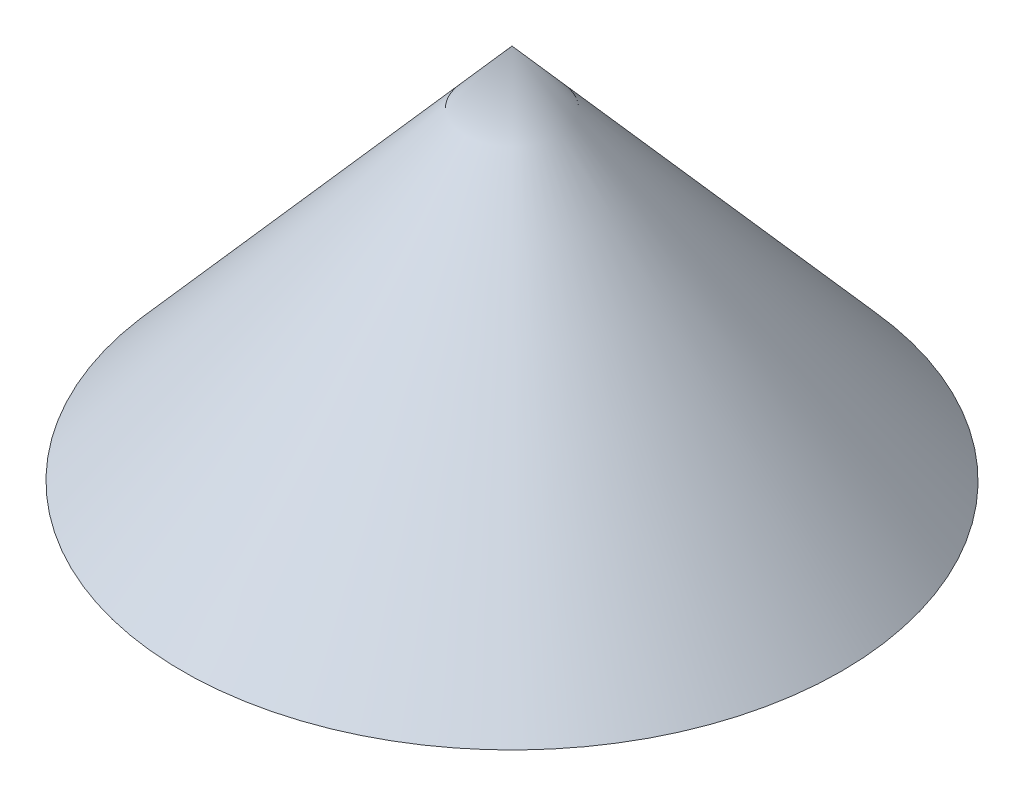
ISO-10303-21;
HEADER;
FILE_DESCRIPTION(('STEP AP214'),'2;1');
FILE_NAME('part.step','',(''),(''),'','','');
FILE_SCHEMA(('AUTOMOTIVE_DESIGN { 1 0 10303 214 1 1 1 1 }'));
ENDSEC;
DATA;
#1=APPLICATION_CONTEXT('core data for automotive mechanical design processes');
#2=APPLICATION_PROTOCOL_DEFINITION('international standard','automotive_design',2000,#1);
#3=PRODUCT_CONTEXT('',#1,'mechanical');
#4=PRODUCT('Part','Part','',(#3));
#5=PRODUCT_RELATED_PRODUCT_CATEGORY('part','',(#4));
#6=PRODUCT_DEFINITION_FORMATION('','',#4);
#7=PRODUCT_DEFINITION_CONTEXT('part definition',#1,'design');
#8=PRODUCT_DEFINITION('design','',#6,#7);
#9=PRODUCT_DEFINITION_SHAPE('','',#8);
#10=(LENGTH_UNIT() NAMED_UNIT(*) SI_UNIT(.MILLI.,.METRE.));
#11=(NAMED_UNIT(*) PLANE_ANGLE_UNIT() SI_UNIT($,.RADIAN.));
#12=(NAMED_UNIT(*) SI_UNIT($,.STERADIAN.) SOLID_ANGLE_UNIT());
#13=UNCERTAINTY_MEASURE_WITH_UNIT(LENGTH_MEASURE(1.E-05),#10,'distance_accuracy_value','');
#14=(GEOMETRIC_REPRESENTATION_CONTEXT(3) GLOBAL_UNCERTAINTY_ASSIGNED_CONTEXT((#13)) GLOBAL_UNIT_ASSIGNED_CONTEXT((#10,
#11,#12)) REPRESENTATION_CONTEXT('',''));
#15=CARTESIAN_POINT('',(0.,0.,0.));
#16=DIRECTION('',(0.,0.,1.));
#17=DIRECTION('',(1.,0.,0.));
#18=AXIS2_PLACEMENT_3D('',#15,#16,#17);
#19=CARTESIAN_POINT('',(0.,0.,0.));
#20=DIRECTION('',(0.,-1.,0.));
#21=DIRECTION('',(1.,0.,0.));
#22=AXIS2_PLACEMENT_3D('',#19,#20,#21);
#23=PLANE('',#22);
#24=CARTESIAN_POINT('',(0.,0.,0.));
#25=DIRECTION('',(0.,1.,0.));
#26=DIRECTION('',(-1.,0.,0.));
#27=AXIS2_PLACEMENT_3D('',#24,#25,#26);
#28=CIRCLE('',#27,0.7);
#29=CARTESIAN_POINT('',(-0.7,0.,0.));
#30=VERTEX_POINT('',#29);
#31=EDGE_CURVE('E11',#30,#30,#28,.T.);
#32=ORIENTED_EDGE('',*,*,#31,.F.);
#33=EDGE_LOOP('',(#32));
#34=FACE_BOUND('',#33,.T.);
#35=ADVANCED_FACE('F39',(#34),#23,.T.);
#36=CARTESIAN_POINT('',(0.,0.8,0.));
#37=DIRECTION('',(0.,-1.,0.));
#38=DIRECTION('',(1.,0.,0.));
#39=AXIS2_PLACEMENT_3D('',#36,#37,#38);
#40=CONICAL_SURFACE('',#39,0.,0.718829999621625);
#41=ORIENTED_EDGE('',*,*,#31,.T.);
#42=EDGE_LOOP('',(#41));
#43=FACE_BOUND('',#42,.T.);
#44=CARTESIAN_POINT('',(0.,0.8,0.));
#45=VERTEX_POINT('',#44);
#46=VERTEX_LOOP('',#45);
#47=FACE_BOUND('',#46,.T.);
#48=ADVANCED_FACE('F47',(#43,#47),#40,.T.);
#49=CLOSED_SHELL('',(#35,#48));
#50=MANIFOLD_SOLID_BREP('B2',#49);
#51=ADVANCED_BREP_SHAPE_REPRESENTATION('',(#18,#50),#14);
#52=SHAPE_DEFINITION_REPRESENTATION(#9,#51);
ENDSEC;
END-ISO-10303-21;
